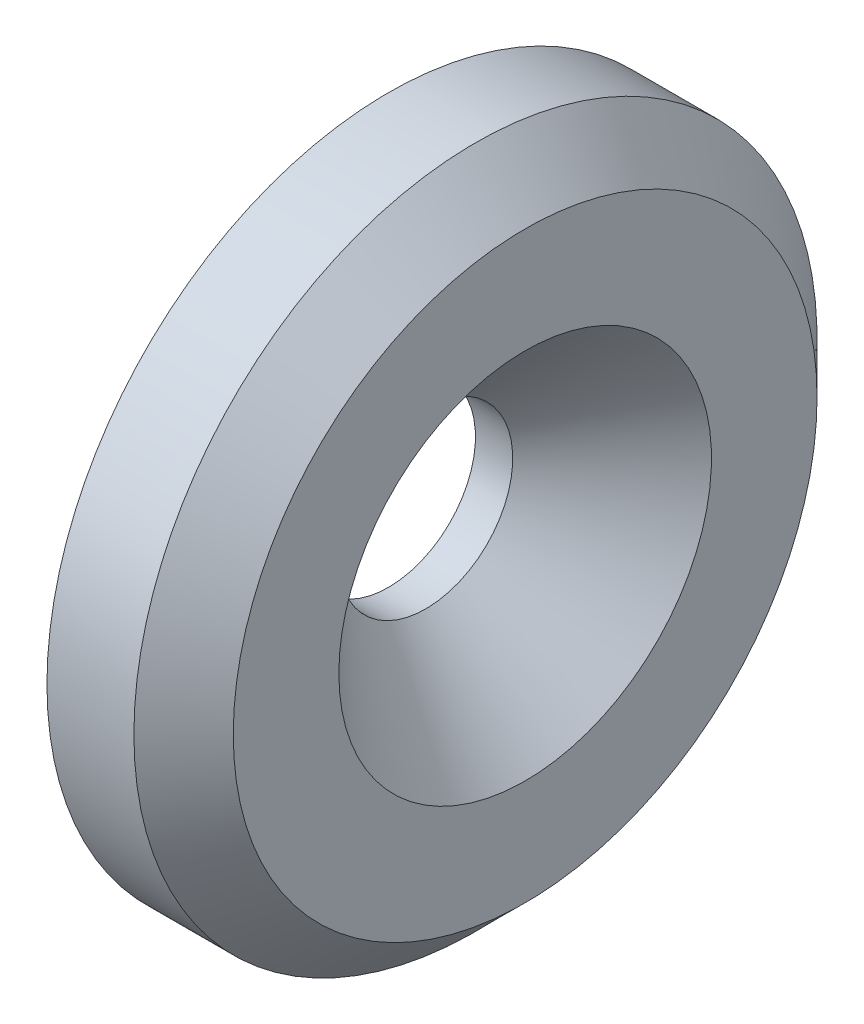
ISO-10303-21;
HEADER;
FILE_DESCRIPTION(('STEP AP214'),'2;1');
FILE_NAME('part.step','',(''),(''),'','','');
FILE_SCHEMA(('AUTOMOTIVE_DESIGN { 1 0 10303 214 1 1 1 1 }'));
ENDSEC;
DATA;
#1=APPLICATION_CONTEXT('core data for automotive mechanical design processes');
#2=APPLICATION_PROTOCOL_DEFINITION('international standard','automotive_design',2000,#1);
#3=PRODUCT_CONTEXT('',#1,'mechanical');
#4=PRODUCT('Part','Part','',(#3));
#5=PRODUCT_RELATED_PRODUCT_CATEGORY('part','',(#4));
#6=PRODUCT_DEFINITION_FORMATION('','',#4);
#7=PRODUCT_DEFINITION_CONTEXT('part definition',#1,'design');
#8=PRODUCT_DEFINITION('design','',#6,#7);
#9=PRODUCT_DEFINITION_SHAPE('','',#8);
#10=(LENGTH_UNIT() NAMED_UNIT(*) SI_UNIT(.MILLI.,.METRE.));
#11=(NAMED_UNIT(*) PLANE_ANGLE_UNIT() SI_UNIT($,.RADIAN.));
#12=(NAMED_UNIT(*) SI_UNIT($,.STERADIAN.) SOLID_ANGLE_UNIT());
#13=UNCERTAINTY_MEASURE_WITH_UNIT(LENGTH_MEASURE(1.E-05),#10,'distance_accuracy_value','');
#14=(GEOMETRIC_REPRESENTATION_CONTEXT(3) GLOBAL_UNCERTAINTY_ASSIGNED_CONTEXT((#13)) GLOBAL_UNIT_ASSIGNED_CONTEXT((#10,
#11,#12)) REPRESENTATION_CONTEXT('',''));
#15=CARTESIAN_POINT('',(0.,0.,0.));
#16=DIRECTION('',(0.,0.,1.));
#17=DIRECTION('',(1.,0.,0.));
#18=AXIS2_PLACEMENT_3D('',#15,#16,#17);
#19=CARTESIAN_POINT('',(-50.1147190613146,0.,0.));
#20=DIRECTION('',(-1.,0.,0.));
#21=DIRECTION('',(0.,0.,1.));
#22=AXIS2_PLACEMENT_3D('',#19,#20,#21);
#23=CYLINDRICAL_SURFACE('',#22,3.5);
#24=CARTESIAN_POINT('',(-4.,0.,0.));
#25=DIRECTION('',(-1.,0.,0.));
#26=DIRECTION('',(0.,0.,1.));
#27=AXIS2_PLACEMENT_3D('',#24,#25,#26);
#28=CIRCLE('',#27,3.5);
#29=CARTESIAN_POINT('',(-4.,0.,3.5));
#30=VERTEX_POINT('',#29);
#31=EDGE_CURVE('E10',#30,#30,#28,.T.);
#32=ORIENTED_EDGE('',*,*,#31,.F.);
#33=EDGE_LOOP('',(#32));
#34=FACE_BOUND('',#33,.T.);
#35=CARTESIAN_POINT('',(-5.50000000000001,0.,0.));
#36=DIRECTION('',(-1.,0.,0.));
#37=DIRECTION('',(0.,0.,1.));
#38=AXIS2_PLACEMENT_3D('',#35,#36,#37);
#39=CIRCLE('',#38,3.5);
#40=CARTESIAN_POINT('',(-5.50000000000001,0.,3.5));
#41=VERTEX_POINT('',#40);
#42=EDGE_CURVE('E55',#41,#41,#39,.T.);
#43=ORIENTED_EDGE('',*,*,#42,.T.);
#44=EDGE_LOOP('',(#43));
#45=FACE_BOUND('',#44,.T.);
#46=ADVANCED_FACE('F33',(#34,#45),#23,.F.);
#47=CARTESIAN_POINT('',(-4.,0.,0.));
#48=DIRECTION('',(1.,0.,0.));
#49=DIRECTION('',(0.,0.,-1.));
#50=AXIS2_PLACEMENT_3D('',#47,#48,#49);
#51=CONICAL_SURFACE('',#50,3.5,0.785398163397442);
#52=CARTESIAN_POINT('',(0.,0.,0.));
#53=DIRECTION('',(-1.,0.,0.));
#54=DIRECTION('',(0.,0.,1.));
#55=AXIS2_PLACEMENT_3D('',#52,#53,#54);
#56=CIRCLE('',#55,7.49999999999996);
#57=CARTESIAN_POINT('',(0.,0.,7.49999999999996));
#58=VERTEX_POINT('',#57);
#59=EDGE_CURVE('E39',#58,#58,#56,.T.);
#60=ORIENTED_EDGE('',*,*,#59,.F.);
#61=EDGE_LOOP('',(#60));
#62=FACE_BOUND('',#61,.T.);
#63=ORIENTED_EDGE('',*,*,#31,.T.);
#64=EDGE_LOOP('',(#63));
#65=FACE_BOUND('',#64,.T.);
#66=ADVANCED_FACE('F80',(#62,#65),#51,.F.);
#67=CARTESIAN_POINT('',(0.,11.75,0.));
#68=DIRECTION('',(-1.,0.,0.));
#69=DIRECTION('',(0.,0.,1.));
#70=AXIS2_PLACEMENT_3D('',#67,#68,#69);
#71=PLANE('',#70);
#72=CARTESIAN_POINT('',(0.,0.,0.));
#73=DIRECTION('',(-1.,0.,0.));
#74=DIRECTION('',(0.,0.,1.));
#75=AXIS2_PLACEMENT_3D('',#72,#73,#74);
#76=CIRCLE('',#75,11.75);
#77=CARTESIAN_POINT('',(0.,0.,11.75));
#78=VERTEX_POINT('',#77);
#79=EDGE_CURVE('E43',#78,#78,#76,.T.);
#80=ORIENTED_EDGE('',*,*,#79,.F.);
#81=EDGE_LOOP('',(#80));
#82=FACE_BOUND('',#81,.T.);
#83=ORIENTED_EDGE('',*,*,#59,.T.);
#84=EDGE_LOOP('',(#83));
#85=FACE_BOUND('',#84,.T.);
#86=ADVANCED_FACE('F75',(#82,#85),#71,.F.);
#87=CARTESIAN_POINT('',(0.,0.,0.));
#88=DIRECTION('',(-1.,0.,0.));
#89=DIRECTION('',(0.,0.,1.));
#90=AXIS2_PLACEMENT_3D('',#87,#88,#89);
#91=CONICAL_SURFACE('',#90,11.75,0.785398163397447);
#92=CARTESIAN_POINT('',(-2.,0.,0.));
#93=DIRECTION('',(-1.,0.,0.));
#94=DIRECTION('',(0.,0.,1.));
#95=AXIS2_PLACEMENT_3D('',#92,#93,#94);
#96=CIRCLE('',#95,13.75);
#97=CARTESIAN_POINT('',(-2.,0.,13.75));
#98=VERTEX_POINT('',#97);
#99=EDGE_CURVE('E47',#98,#98,#96,.T.);
#100=ORIENTED_EDGE('',*,*,#99,.F.);
#101=EDGE_LOOP('',(#100));
#102=FACE_BOUND('',#101,.T.);
#103=ORIENTED_EDGE('',*,*,#79,.T.);
#104=EDGE_LOOP('',(#103));
#105=FACE_BOUND('',#104,.T.);
#106=ADVANCED_FACE('F69',(#102,#105),#91,.T.);
#107=CARTESIAN_POINT('',(-50.1147190613146,0.,0.));
#108=DIRECTION('',(-1.,0.,0.));
#109=DIRECTION('',(0.,0.,1.));
#110=AXIS2_PLACEMENT_3D('',#107,#108,#109);
#111=CYLINDRICAL_SURFACE('',#110,13.75);
#112=CARTESIAN_POINT('',(-5.5,0.,0.));
#113=DIRECTION('',(-1.,0.,0.));
#114=DIRECTION('',(0.,0.,1.));
#115=AXIS2_PLACEMENT_3D('',#112,#113,#114);
#116=CIRCLE('',#115,13.75);
#117=CARTESIAN_POINT('',(-5.5,0.,13.75));
#118=VERTEX_POINT('',#117);
#119=EDGE_CURVE('E52',#118,#118,#116,.T.);
#120=ORIENTED_EDGE('',*,*,#119,.F.);
#121=EDGE_LOOP('',(#120));
#122=FACE_BOUND('',#121,.T.);
#123=ORIENTED_EDGE('',*,*,#99,.T.);
#124=EDGE_LOOP('',(#123));
#125=FACE_BOUND('',#124,.T.);
#126=ADVANCED_FACE('F63',(#122,#125),#111,.T.);
#127=CARTESIAN_POINT('',(-5.5,3.5,0.));
#128=DIRECTION('',(1.,0.,0.));
#129=DIRECTION('',(0.,0.,-1.));
#130=AXIS2_PLACEMENT_3D('',#127,#128,#129);
#131=PLANE('',#130);
#132=ORIENTED_EDGE('',*,*,#42,.F.);
#133=EDGE_LOOP('',(#132));
#134=FACE_BOUND('',#133,.T.);
#135=ORIENTED_EDGE('',*,*,#119,.T.);
#136=EDGE_LOOP('',(#135));
#137=FACE_BOUND('',#136,.T.);
#138=ADVANCED_FACE('F60',(#134,#137),#131,.F.);
#139=CLOSED_SHELL('',(#46,#66,#86,#106,#126,#138));
#140=MANIFOLD_SOLID_BREP('B2',#139);
#141=ADVANCED_BREP_SHAPE_REPRESENTATION('',(#18,#140),#14);
#142=SHAPE_DEFINITION_REPRESENTATION(#9,#141);
ENDSEC;
END-ISO-10303-21;
